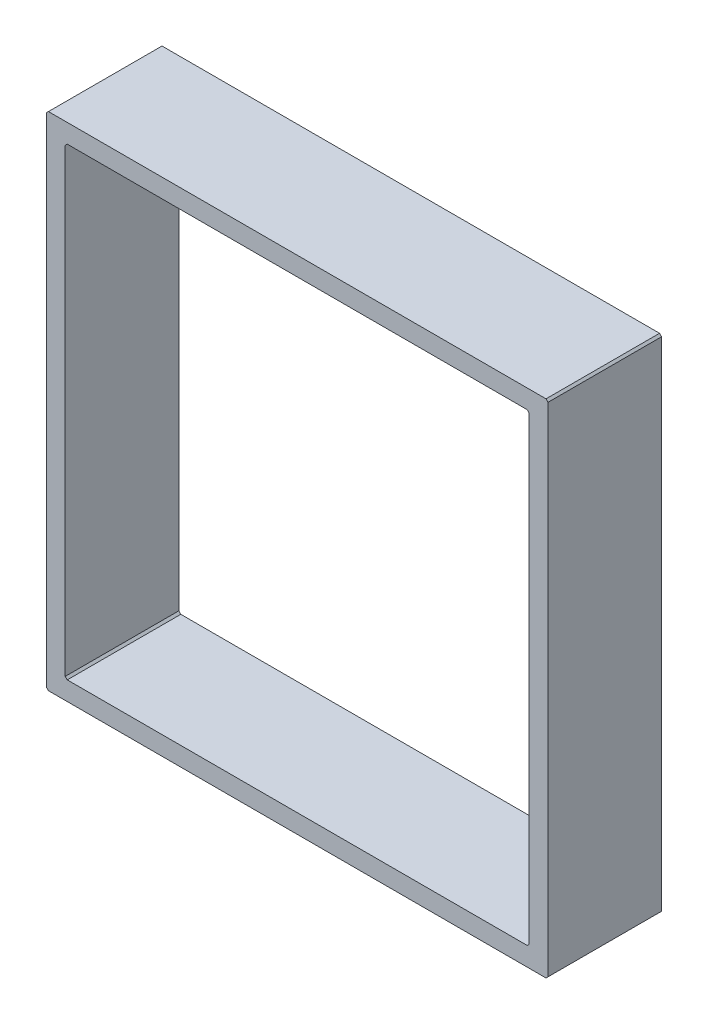
ISO-10303-21;
HEADER;
FILE_DESCRIPTION(('STEP AP214'),'2;1');
FILE_NAME('part.step','',(''),(''),'','','');
FILE_SCHEMA(('AUTOMOTIVE_DESIGN { 1 0 10303 214 1 1 1 1 }'));
ENDSEC;
DATA;
#1=APPLICATION_CONTEXT('core data for automotive mechanical design processes');
#2=APPLICATION_PROTOCOL_DEFINITION('international standard','automotive_design',2000,#1);
#3=PRODUCT_CONTEXT('',#1,'mechanical');
#4=PRODUCT('Part','Part','',(#3));
#5=PRODUCT_RELATED_PRODUCT_CATEGORY('part','',(#4));
#6=PRODUCT_DEFINITION_FORMATION('','',#4);
#7=PRODUCT_DEFINITION_CONTEXT('part definition',#1,'design');
#8=PRODUCT_DEFINITION('design','',#6,#7);
#9=PRODUCT_DEFINITION_SHAPE('','',#8);
#10=(LENGTH_UNIT() NAMED_UNIT(*) SI_UNIT(.MILLI.,.METRE.));
#11=(NAMED_UNIT(*) PLANE_ANGLE_UNIT() SI_UNIT($,.RADIAN.));
#12=(NAMED_UNIT(*) SI_UNIT($,.STERADIAN.) SOLID_ANGLE_UNIT());
#13=UNCERTAINTY_MEASURE_WITH_UNIT(LENGTH_MEASURE(1.E-05),#10,'distance_accuracy_value','');
#14=(GEOMETRIC_REPRESENTATION_CONTEXT(3) GLOBAL_UNCERTAINTY_ASSIGNED_CONTEXT((#13)) GLOBAL_UNIT_ASSIGNED_CONTEXT((#10,
#11,#12)) REPRESENTATION_CONTEXT('',''));
#15=CARTESIAN_POINT('',(0.,0.,0.));
#16=DIRECTION('',(0.,0.,1.));
#17=DIRECTION('',(1.,0.,0.));
#18=AXIS2_PLACEMENT_3D('',#15,#16,#17);
#19=CARTESIAN_POINT('',(-63.5,61.11875,14.375));
#20=DIRECTION('',(1.,0.,0.));
#21=DIRECTION('',(0.,1.,0.));
#22=AXIS2_PLACEMENT_3D('',#19,#20,#21);
#23=PLANE('',#22);
#24=DIRECTION('',(0.,-1.,0.));
#25=VECTOR('',#24,1.);
#26=CARTESIAN_POINT('',(-63.5,61.11875,14.375));
#27=LINE('',#26,#25);
#28=CARTESIAN_POINT('',(-63.5,62.992,14.375));
#29=VERTEX_POINT('',#28);
#30=CARTESIAN_POINT('',(-63.5,-62.992,14.375));
#31=VERTEX_POINT('',#30);
#32=EDGE_CURVE('E246',#29,#31,#27,.T.);
#33=ORIENTED_EDGE('',*,*,#32,.F.);
#34=DIRECTION('',(0.,0.,-1.));
#35=VECTOR('',#34,1.);
#36=CARTESIAN_POINT('',(-63.5,62.992,14.375));
#37=LINE('',#36,#35);
#38=CARTESIAN_POINT('',(-63.5,62.992,-14.375));
#39=VERTEX_POINT('',#38);
#40=EDGE_CURVE('E268',#29,#39,#37,.T.);
#41=ORIENTED_EDGE('',*,*,#40,.T.);
#42=DIRECTION('',(0.,-1.,0.));
#43=VECTOR('',#42,1.);
#44=CARTESIAN_POINT('',(-63.5,61.11875,-14.375));
#45=LINE('',#44,#43);
#46=CARTESIAN_POINT('',(-63.5,-62.992,-14.375));
#47=VERTEX_POINT('',#46);
#48=EDGE_CURVE('E245',#39,#47,#45,.T.);
#49=ORIENTED_EDGE('',*,*,#48,.T.);
#50=DIRECTION('',(0.,0.,-1.));
#51=VECTOR('',#50,1.);
#52=CARTESIAN_POINT('',(-63.5,-62.992,14.375));
#53=LINE('',#52,#51);
#54=EDGE_CURVE('E201',#31,#47,#53,.T.);
#55=ORIENTED_EDGE('',*,*,#54,.F.);
#56=EDGE_LOOP('',(#33,#41,#49,#55));
#57=FACE_BOUND('',#56,.T.);
#58=ADVANCED_FACE('F36',(#57),#23,.F.);
#59=CARTESIAN_POINT('',(-58.7375,61.11875,14.375));
#60=DIRECTION('',(1.,0.,0.));
#61=DIRECTION('',(0.,1.,0.));
#62=AXIS2_PLACEMENT_3D('',#59,#60,#61);
#63=PLANE('',#62);
#64=DIRECTION('',(0.,-1.,0.));
#65=VECTOR('',#64,1.);
#66=CARTESIAN_POINT('',(-58.7375,61.11875,-14.375));
#67=LINE('',#66,#65);
#68=CARTESIAN_POINT('',(-58.7375,58.2295,-14.375));
#69=VERTEX_POINT('',#68);
#70=CARTESIAN_POINT('',(-58.7375,-58.2295,-14.375));
#71=VERTEX_POINT('',#70);
#72=EDGE_CURVE('E258',#69,#71,#67,.T.);
#73=ORIENTED_EDGE('',*,*,#72,.F.);
#74=DIRECTION('',(0.,0.,1.));
#75=VECTOR('',#74,1.);
#76=CARTESIAN_POINT('',(-58.7375,58.2295,14.375));
#77=LINE('',#76,#75);
#78=CARTESIAN_POINT('',(-58.7375,58.2295,14.375));
#79=VERTEX_POINT('',#78);
#80=EDGE_CURVE('E266',#69,#79,#77,.T.);
#81=ORIENTED_EDGE('',*,*,#80,.T.);
#82=DIRECTION('',(0.,-1.,0.));
#83=VECTOR('',#82,1.);
#84=CARTESIAN_POINT('',(-58.7375,61.11875,14.375));
#85=LINE('',#84,#83);
#86=CARTESIAN_POINT('',(-58.7375,-58.2295,14.375));
#87=VERTEX_POINT('',#86);
#88=EDGE_CURVE('E248',#79,#87,#85,.T.);
#89=ORIENTED_EDGE('',*,*,#88,.T.);
#90=DIRECTION('',(0.,0.,1.));
#91=VECTOR('',#90,1.);
#92=CARTESIAN_POINT('',(-58.7375,-58.2295,14.375));
#93=LINE('',#92,#91);
#94=EDGE_CURVE('E198',#71,#87,#93,.T.);
#95=ORIENTED_EDGE('',*,*,#94,.F.);
#96=EDGE_LOOP('',(#73,#81,#89,#95));
#97=FACE_BOUND('',#96,.T.);
#98=ADVANCED_FACE('F281',(#97),#63,.T.);
#99=CARTESIAN_POINT('',(0.,58.7375,14.375));
#100=DIRECTION('',(0.,-1.,0.));
#101=DIRECTION('',(1.,0.,0.));
#102=AXIS2_PLACEMENT_3D('',#99,#100,#101);
#103=PLANE('',#102);
#104=DIRECTION('',(-1.,0.,0.));
#105=VECTOR('',#104,1.);
#106=CARTESIAN_POINT('',(0.,58.7375,14.375));
#107=LINE('',#106,#105);
#108=CARTESIAN_POINT('',(58.2295,58.7375,14.375));
#109=VERTEX_POINT('',#108);
#110=CARTESIAN_POINT('',(-58.2295,58.7375,14.375));
#111=VERTEX_POINT('',#110);
#112=EDGE_CURVE('E251',#109,#111,#107,.T.);
#113=ORIENTED_EDGE('',*,*,#112,.T.);
#114=DIRECTION('',(0.,0.,-1.));
#115=VECTOR('',#114,1.);
#116=CARTESIAN_POINT('',(-58.2295,58.7375,-14.375));
#117=LINE('',#116,#115);
#118=CARTESIAN_POINT('',(-58.2295,58.7375,-14.375));
#119=VERTEX_POINT('',#118);
#120=EDGE_CURVE('E256',#111,#119,#117,.T.);
#121=ORIENTED_EDGE('',*,*,#120,.T.);
#122=DIRECTION('',(-1.,0.,0.));
#123=VECTOR('',#122,1.);
#124=CARTESIAN_POINT('',(0.,58.7375,-14.375));
#125=LINE('',#124,#123);
#126=CARTESIAN_POINT('',(58.2295,58.7375,-14.375));
#127=VERTEX_POINT('',#126);
#128=EDGE_CURVE('E260',#127,#119,#125,.T.);
#129=ORIENTED_EDGE('',*,*,#128,.F.);
#130=DIRECTION('',(0.,0.,-1.));
#131=VECTOR('',#130,1.);
#132=CARTESIAN_POINT('',(58.2295,58.7375,-14.375));
#133=LINE('',#132,#131);
#134=EDGE_CURVE('E221',#109,#127,#133,.T.);
#135=ORIENTED_EDGE('',*,*,#134,.F.);
#136=EDGE_LOOP('',(#113,#121,#129,#135));
#137=FACE_BOUND('',#136,.T.);
#138=ADVANCED_FACE('F290',(#137),#103,.T.);
#139=CARTESIAN_POINT('',(0.,63.5,14.375));
#140=DIRECTION('',(0.,-1.,0.));
#141=DIRECTION('',(1.,0.,0.));
#142=AXIS2_PLACEMENT_3D('',#139,#140,#141);
#143=PLANE('',#142);
#144=DIRECTION('',(-1.,0.,0.));
#145=VECTOR('',#144,1.);
#146=CARTESIAN_POINT('',(0.,63.5,-14.375));
#147=LINE('',#146,#145);
#148=CARTESIAN_POINT('',(62.992,63.5,-14.375));
#149=VERTEX_POINT('',#148);
#150=CARTESIAN_POINT('',(-62.992,63.5,-14.375));
#151=VERTEX_POINT('',#150);
#152=EDGE_CURVE('E249',#149,#151,#147,.T.);
#153=ORIENTED_EDGE('',*,*,#152,.T.);
#154=DIRECTION('',(0.,0.,1.));
#155=VECTOR('',#154,1.);
#156=CARTESIAN_POINT('',(-62.992,63.5,14.375));
#157=LINE('',#156,#155);
#158=CARTESIAN_POINT('',(-62.992,63.5,14.375));
#159=VERTEX_POINT('',#158);
#160=EDGE_CURVE('E51',#151,#159,#157,.T.);
#161=ORIENTED_EDGE('',*,*,#160,.T.);
#162=DIRECTION('',(-1.,0.,0.));
#163=VECTOR('',#162,1.);
#164=CARTESIAN_POINT('',(0.,63.5,14.375));
#165=LINE('',#164,#163);
#166=CARTESIAN_POINT('',(62.992,63.5,14.375));
#167=VERTEX_POINT('',#166);
#168=EDGE_CURVE('E254',#167,#159,#165,.T.);
#169=ORIENTED_EDGE('',*,*,#168,.F.);
#170=DIRECTION('',(0.,0.,1.));
#171=VECTOR('',#170,1.);
#172=CARTESIAN_POINT('',(62.992,63.5,14.375));
#173=LINE('',#172,#171);
#174=EDGE_CURVE('E235',#149,#167,#173,.T.);
#175=ORIENTED_EDGE('',*,*,#174,.F.);
#176=EDGE_LOOP('',(#153,#161,#169,#175));
#177=FACE_BOUND('',#176,.T.);
#178=ADVANCED_FACE('F328',(#177),#143,.F.);
#179=CARTESIAN_POINT('',(-63.5,0.,14.375));
#180=DIRECTION('',(0.,0.,-1.));
#181=DIRECTION('',(-1.,0.,0.));
#182=AXIS2_PLACEMENT_3D('',#179,#180,#181);
#183=PLANE('',#182);
#184=ORIENTED_EDGE('',*,*,#32,.T.);
#185=DIRECTION('',(0.707106781186548,-0.707106781186548,0.));
#186=VECTOR('',#185,1.);
#187=CARTESIAN_POINT('',(-63.5,-62.992,14.375));
#188=LINE('',#187,#186);
#189=CARTESIAN_POINT('',(-62.992,-63.5,14.375));
#190=VERTEX_POINT('',#189);
#191=EDGE_CURVE('E209',#190,#31,#188,.F.);
#192=ORIENTED_EDGE('',*,*,#191,.F.);
#193=DIRECTION('',(-1.,0.,0.));
#194=VECTOR('',#193,1.);
#195=CARTESIAN_POINT('',(0.,-63.5,14.375));
#196=LINE('',#195,#194);
#197=CARTESIAN_POINT('',(62.992,-63.5,14.375));
#198=VERTEX_POINT('',#197);
#199=EDGE_CURVE('E191',#198,#190,#196,.T.);
#200=ORIENTED_EDGE('',*,*,#199,.F.);
#201=DIRECTION('',(-0.707106781186548,-0.707106781186547,0.));
#202=VECTOR('',#201,1.);
#203=CARTESIAN_POINT('',(63.5,-62.992,14.375));
#204=LINE('',#203,#202);
#205=CARTESIAN_POINT('',(63.5,-62.992,14.375));
#206=VERTEX_POINT('',#205);
#207=EDGE_CURVE('E161',#198,#206,#204,.F.);
#208=ORIENTED_EDGE('',*,*,#207,.T.);
#209=DIRECTION('',(0.,-1.,0.));
#210=VECTOR('',#209,1.);
#211=CARTESIAN_POINT('',(63.5,61.11875,14.375));
#212=LINE('',#211,#210);
#213=CARTESIAN_POINT('',(63.5,62.992,14.375));
#214=VERTEX_POINT('',#213);
#215=EDGE_CURVE('E216',#214,#206,#212,.T.);
#216=ORIENTED_EDGE('',*,*,#215,.F.);
#217=DIRECTION('',(-0.707106781186548,0.707106781186547,0.));
#218=VECTOR('',#217,1.);
#219=CARTESIAN_POINT('',(63.5,62.992,14.375));
#220=LINE('',#219,#218);
#221=EDGE_CURVE('E238',#167,#214,#220,.F.);
#222=ORIENTED_EDGE('',*,*,#221,.F.);
#223=ORIENTED_EDGE('',*,*,#168,.T.);
#224=DIRECTION('',(0.707106781186548,0.707106781186548,0.));
#225=VECTOR('',#224,1.);
#226=CARTESIAN_POINT('',(-63.5,62.992,14.375));
#227=LINE('',#226,#225);
#228=EDGE_CURVE('E273',#159,#29,#227,.F.);
#229=ORIENTED_EDGE('',*,*,#228,.T.);
#230=EDGE_LOOP('',(#184,#192,#200,#208,#216,#222,#223,#229));
#231=FACE_BOUND('',#230,.T.);
#232=DIRECTION('',(-0.707106781186538,0.707106781186557,0.));
#233=VECTOR('',#232,1.);
#234=CARTESIAN_POINT('',(-90.2334999999999,-26.7334999999992,14.375));
#235=LINE('',#234,#233);
#236=CARTESIAN_POINT('',(-58.2295,-58.7375,14.375));
#237=VERTEX_POINT('',#236);
#238=EDGE_CURVE('E213',#87,#237,#235,.F.);
#239=ORIENTED_EDGE('',*,*,#238,.F.);
#240=ORIENTED_EDGE('',*,*,#88,.F.);
#241=DIRECTION('',(-0.707106781186538,-0.707106781186557,0.));
#242=VECTOR('',#241,1.);
#243=CARTESIAN_POINT('',(-90.2334999999999,26.7334999999992,14.375));
#244=LINE('',#243,#242);
#245=EDGE_CURVE('E11',#79,#111,#244,.F.);
#246=ORIENTED_EDGE('',*,*,#245,.T.);
#247=ORIENTED_EDGE('',*,*,#112,.F.);
#248=DIRECTION('',(0.707106781186538,-0.707106781186557,0.));
#249=VECTOR('',#248,1.);
#250=CARTESIAN_POINT('',(90.2334999999999,26.7334999999992,14.375));
#251=LINE('',#250,#249);
#252=CARTESIAN_POINT('',(58.7375,58.2295,14.375));
#253=VERTEX_POINT('',#252);
#254=EDGE_CURVE('E242',#253,#109,#251,.F.);
#255=ORIENTED_EDGE('',*,*,#254,.F.);
#256=DIRECTION('',(0.,-1.,0.));
#257=VECTOR('',#256,1.);
#258=CARTESIAN_POINT('',(58.7375,61.11875,14.375));
#259=LINE('',#258,#257);
#260=CARTESIAN_POINT('',(58.7375,-58.2295,14.375));
#261=VERTEX_POINT('',#260);
#262=EDGE_CURVE('E218',#253,#261,#259,.T.);
#263=ORIENTED_EDGE('',*,*,#262,.T.);
#264=DIRECTION('',(0.707106781186538,0.707106781186557,0.));
#265=VECTOR('',#264,1.);
#266=CARTESIAN_POINT('',(90.2334999999999,-26.7334999999992,14.375));
#267=LINE('',#266,#265);
#268=CARTESIAN_POINT('',(58.2295,-58.7375,14.375));
#269=VERTEX_POINT('',#268);
#270=EDGE_CURVE('E160',#261,#269,#267,.F.);
#271=ORIENTED_EDGE('',*,*,#270,.T.);
#272=DIRECTION('',(-1.,0.,0.));
#273=VECTOR('',#272,1.);
#274=CARTESIAN_POINT('',(0.,-58.7375,14.375));
#275=LINE('',#274,#273);
#276=EDGE_CURVE('E175',#269,#237,#275,.T.);
#277=ORIENTED_EDGE('',*,*,#276,.T.);
#278=EDGE_LOOP('',(#239,#240,#246,#247,#255,#263,#271,#277));
#279=FACE_BOUND('',#278,.T.);
#280=ADVANCED_FACE('F287',(#231,#279),#183,.F.);
#281=CARTESIAN_POINT('',(-63.5,0.,-14.375));
#282=DIRECTION('',(0.,0.,-1.));
#283=DIRECTION('',(-1.,0.,0.));
#284=AXIS2_PLACEMENT_3D('',#281,#282,#283);
#285=PLANE('',#284);
#286=DIRECTION('',(-0.707106781186548,0.707106781186548,0.));
#287=VECTOR('',#286,1.);
#288=CARTESIAN_POINT('',(-94.996,-31.496,-14.375));
#289=LINE('',#288,#287);
#290=CARTESIAN_POINT('',(-62.992,-63.5,-14.375));
#291=VERTEX_POINT('',#290);
#292=EDGE_CURVE('E204',#47,#291,#289,.F.);
#293=ORIENTED_EDGE('',*,*,#292,.F.);
#294=ORIENTED_EDGE('',*,*,#48,.F.);
#295=DIRECTION('',(-0.707106781186548,-0.707106781186548,0.));
#296=VECTOR('',#295,1.);
#297=CARTESIAN_POINT('',(-94.996,31.496,-14.375));
#298=LINE('',#297,#296);
#299=EDGE_CURVE('E59',#39,#151,#298,.F.);
#300=ORIENTED_EDGE('',*,*,#299,.T.);
#301=ORIENTED_EDGE('',*,*,#152,.F.);
#302=DIRECTION('',(0.707106781186548,-0.707106781186547,0.));
#303=VECTOR('',#302,1.);
#304=CARTESIAN_POINT('',(94.996,31.496,-14.375));
#305=LINE('',#304,#303);
#306=CARTESIAN_POINT('',(63.5,62.992,-14.375));
#307=VERTEX_POINT('',#306);
#308=EDGE_CURVE('E232',#307,#149,#305,.F.);
#309=ORIENTED_EDGE('',*,*,#308,.F.);
#310=DIRECTION('',(0.,-1.,0.));
#311=VECTOR('',#310,1.);
#312=CARTESIAN_POINT('',(63.5,61.11875,-14.375));
#313=LINE('',#312,#311);
#314=CARTESIAN_POINT('',(63.5,-62.992,-14.375));
#315=VERTEX_POINT('',#314);
#316=EDGE_CURVE('E215',#307,#315,#313,.T.);
#317=ORIENTED_EDGE('',*,*,#316,.T.);
#318=DIRECTION('',(0.707106781186548,0.707106781186547,0.));
#319=VECTOR('',#318,1.);
#320=CARTESIAN_POINT('',(94.996,-31.496,-14.375));
#321=LINE('',#320,#319);
#322=CARTESIAN_POINT('',(62.992,-63.5,-14.375));
#323=VERTEX_POINT('',#322);
#324=EDGE_CURVE('E182',#315,#323,#321,.F.);
#325=ORIENTED_EDGE('',*,*,#324,.T.);
#326=DIRECTION('',(-1.,0.,0.));
#327=VECTOR('',#326,1.);
#328=CARTESIAN_POINT('',(0.,-63.5,-14.375));
#329=LINE('',#328,#327);
#330=EDGE_CURVE('E171',#323,#291,#329,.T.);
#331=ORIENTED_EDGE('',*,*,#330,.T.);
#332=EDGE_LOOP('',(#293,#294,#300,#301,#309,#317,#325,#331));
#333=FACE_BOUND('',#332,.T.);
#334=ORIENTED_EDGE('',*,*,#72,.T.);
#335=DIRECTION('',(0.707106781186538,-0.707106781186557,0.));
#336=VECTOR('',#335,1.);
#337=CARTESIAN_POINT('',(-58.2295,-58.7375,-14.375));
#338=LINE('',#337,#336);
#339=CARTESIAN_POINT('',(-58.2295,-58.7375,-14.375));
#340=VERTEX_POINT('',#339);
#341=EDGE_CURVE('E167',#340,#71,#338,.F.);
#342=ORIENTED_EDGE('',*,*,#341,.F.);
#343=DIRECTION('',(-1.,0.,0.));
#344=VECTOR('',#343,1.);
#345=CARTESIAN_POINT('',(0.,-58.7375,-14.375));
#346=LINE('',#345,#344);
#347=CARTESIAN_POINT('',(58.2295,-58.7375,-14.375));
#348=VERTEX_POINT('',#347);
#349=EDGE_CURVE('E164',#348,#340,#346,.T.);
#350=ORIENTED_EDGE('',*,*,#349,.F.);
#351=DIRECTION('',(-0.707106781186538,-0.707106781186557,0.));
#352=VECTOR('',#351,1.);
#353=CARTESIAN_POINT('',(58.2295,-58.7375,-14.375));
#354=LINE('',#353,#352);
#355=CARTESIAN_POINT('',(58.7375,-58.2295,-14.375));
#356=VERTEX_POINT('',#355);
#357=EDGE_CURVE('E149',#348,#356,#354,.F.);
#358=ORIENTED_EDGE('',*,*,#357,.T.);
#359=DIRECTION('',(0.,-1.,0.));
#360=VECTOR('',#359,1.);
#361=CARTESIAN_POINT('',(58.7375,61.11875,-14.375));
#362=LINE('',#361,#360);
#363=CARTESIAN_POINT('',(58.7375,58.2295,-14.375));
#364=VERTEX_POINT('',#363);
#365=EDGE_CURVE('E219',#364,#356,#362,.T.);
#366=ORIENTED_EDGE('',*,*,#365,.F.);
#367=DIRECTION('',(-0.707106781186538,0.707106781186557,0.));
#368=VECTOR('',#367,1.);
#369=CARTESIAN_POINT('',(58.2295,58.7375,-14.375));
#370=LINE('',#369,#368);
#371=EDGE_CURVE('E240',#127,#364,#370,.F.);
#372=ORIENTED_EDGE('',*,*,#371,.F.);
#373=ORIENTED_EDGE('',*,*,#128,.T.);
#374=DIRECTION('',(0.707106781186538,0.707106781186557,0.));
#375=VECTOR('',#374,1.);
#376=CARTESIAN_POINT('',(-58.2295,58.7375,-14.375));
#377=LINE('',#376,#375);
#378=EDGE_CURVE('E44',#119,#69,#377,.F.);
#379=ORIENTED_EDGE('',*,*,#378,.T.);
#380=EDGE_LOOP('',(#334,#342,#350,#358,#366,#372,#373,#379));
#381=FACE_BOUND('',#380,.T.);
#382=ADVANCED_FACE('F165',(#333,#381),#285,.T.);
#383=CARTESIAN_POINT('',(-58.2295,58.7375,14.375));
#384=DIRECTION('',(0.707106781186557,-0.707106781186538,0.));
#385=DIRECTION('',(0.707106781186538,0.707106781186557,0.));
#386=AXIS2_PLACEMENT_3D('',#383,#384,#385);
#387=PLANE('',#386);
#388=ORIENTED_EDGE('',*,*,#245,.F.);
#389=ORIENTED_EDGE('',*,*,#80,.F.);
#390=ORIENTED_EDGE('',*,*,#378,.F.);
#391=ORIENTED_EDGE('',*,*,#120,.F.);
#392=EDGE_LOOP('',(#388,#389,#390,#391));
#393=FACE_BOUND('',#392,.T.);
#394=ADVANCED_FACE('F284',(#393),#387,.T.);
#395=CARTESIAN_POINT('',(-63.5,62.992,14.375));
#396=DIRECTION('',(0.707106781186547,-0.707106781186547,0.));
#397=DIRECTION('',(0.707106781186548,0.707106781186548,0.));
#398=AXIS2_PLACEMENT_3D('',#395,#396,#397);
#399=PLANE('',#398);
#400=ORIENTED_EDGE('',*,*,#228,.F.);
#401=ORIENTED_EDGE('',*,*,#160,.F.);
#402=ORIENTED_EDGE('',*,*,#299,.F.);
#403=ORIENTED_EDGE('',*,*,#40,.F.);
#404=EDGE_LOOP('',(#400,#401,#402,#403));
#405=FACE_BOUND('',#404,.T.);
#406=ADVANCED_FACE('F38',(#405),#399,.F.);
#407=CARTESIAN_POINT('',(63.5,61.11875,14.375));
#408=DIRECTION('',(-1.,0.,0.));
#409=DIRECTION('',(0.,1.,0.));
#410=AXIS2_PLACEMENT_3D('',#407,#408,#409);
#411=PLANE('',#410);
#412=ORIENTED_EDGE('',*,*,#215,.T.);
#413=DIRECTION('',(0.,0.,-1.));
#414=VECTOR('',#413,1.);
#415=CARTESIAN_POINT('',(63.5,-62.992,14.375));
#416=LINE('',#415,#414);
#417=EDGE_CURVE('E177',#206,#315,#416,.T.);
#418=ORIENTED_EDGE('',*,*,#417,.T.);
#419=ORIENTED_EDGE('',*,*,#316,.F.);
#420=DIRECTION('',(0.,0.,-1.));
#421=VECTOR('',#420,1.);
#422=CARTESIAN_POINT('',(63.5,62.992,14.375));
#423=LINE('',#422,#421);
#424=EDGE_CURVE('E229',#214,#307,#423,.T.);
#425=ORIENTED_EDGE('',*,*,#424,.F.);
#426=EDGE_LOOP('',(#412,#418,#419,#425));
#427=FACE_BOUND('',#426,.T.);
#428=ADVANCED_FACE('F298',(#427),#411,.F.);
#429=CARTESIAN_POINT('',(58.7375,61.11875,14.375));
#430=DIRECTION('',(-1.,0.,0.));
#431=DIRECTION('',(0.,1.,0.));
#432=AXIS2_PLACEMENT_3D('',#429,#430,#431);
#433=PLANE('',#432);
#434=ORIENTED_EDGE('',*,*,#365,.T.);
#435=DIRECTION('',(0.,0.,1.));
#436=VECTOR('',#435,1.);
#437=CARTESIAN_POINT('',(58.7375,-58.2295,14.375));
#438=LINE('',#437,#436);
#439=EDGE_CURVE('E157',#356,#261,#438,.T.);
#440=ORIENTED_EDGE('',*,*,#439,.T.);
#441=ORIENTED_EDGE('',*,*,#262,.F.);
#442=DIRECTION('',(0.,0.,1.));
#443=VECTOR('',#442,1.);
#444=CARTESIAN_POINT('',(58.7375,58.2295,14.375));
#445=LINE('',#444,#443);
#446=EDGE_CURVE('E226',#364,#253,#445,.T.);
#447=ORIENTED_EDGE('',*,*,#446,.F.);
#448=EDGE_LOOP('',(#434,#440,#441,#447));
#449=FACE_BOUND('',#448,.T.);
#450=ADVANCED_FACE('F296',(#449),#433,.T.);
#451=CARTESIAN_POINT('',(58.2295,58.7375,14.375));
#452=DIRECTION('',(-0.707106781186557,-0.707106781186538,0.));
#453=DIRECTION('',(-0.707106781186538,0.707106781186557,0.));
#454=AXIS2_PLACEMENT_3D('',#451,#452,#453);
#455=PLANE('',#454);
#456=ORIENTED_EDGE('',*,*,#254,.T.);
#457=ORIENTED_EDGE('',*,*,#134,.T.);
#458=ORIENTED_EDGE('',*,*,#371,.T.);
#459=ORIENTED_EDGE('',*,*,#446,.T.);
#460=EDGE_LOOP('',(#456,#457,#458,#459));
#461=FACE_BOUND('',#460,.T.);
#462=ADVANCED_FACE('F292',(#461),#455,.T.);
#463=CARTESIAN_POINT('',(63.5,62.992,14.375));
#464=DIRECTION('',(-0.707106781186547,-0.707106781186548,0.));
#465=DIRECTION('',(-0.707106781186548,0.707106781186547,0.));
#466=AXIS2_PLACEMENT_3D('',#463,#464,#465);
#467=PLANE('',#466);
#468=ORIENTED_EDGE('',*,*,#221,.T.);
#469=ORIENTED_EDGE('',*,*,#424,.T.);
#470=ORIENTED_EDGE('',*,*,#308,.T.);
#471=ORIENTED_EDGE('',*,*,#174,.T.);
#472=EDGE_LOOP('',(#468,#469,#470,#471));
#473=FACE_BOUND('',#472,.T.);
#474=ADVANCED_FACE('F304',(#473),#467,.F.);
#475=CARTESIAN_POINT('',(0.,-58.7375,14.375));
#476=DIRECTION('',(0.,1.,0.));
#477=DIRECTION('',(1.,0.,0.));
#478=AXIS2_PLACEMENT_3D('',#475,#476,#477);
#479=PLANE('',#478);
#480=ORIENTED_EDGE('',*,*,#276,.F.);
#481=DIRECTION('',(0.,0.,-1.));
#482=VECTOR('',#481,1.);
#483=CARTESIAN_POINT('',(58.2295,-58.7375,-14.375));
#484=LINE('',#483,#482);
#485=EDGE_CURVE('E154',#269,#348,#484,.T.);
#486=ORIENTED_EDGE('',*,*,#485,.T.);
#487=ORIENTED_EDGE('',*,*,#349,.T.);
#488=DIRECTION('',(0.,0.,-1.));
#489=VECTOR('',#488,1.);
#490=CARTESIAN_POINT('',(-58.2295,-58.7375,-14.375));
#491=LINE('',#490,#489);
#492=EDGE_CURVE('E193',#237,#340,#491,.T.);
#493=ORIENTED_EDGE('',*,*,#492,.F.);
#494=EDGE_LOOP('',(#480,#486,#487,#493));
#495=FACE_BOUND('',#494,.T.);
#496=ADVANCED_FACE('F173',(#495),#479,.T.);
#497=CARTESIAN_POINT('',(0.,-63.5,14.375));
#498=DIRECTION('',(0.,1.,0.));
#499=DIRECTION('',(1.,0.,0.));
#500=AXIS2_PLACEMENT_3D('',#497,#498,#499);
#501=PLANE('',#500);
#502=ORIENTED_EDGE('',*,*,#330,.F.);
#503=DIRECTION('',(0.,0.,1.));
#504=VECTOR('',#503,1.);
#505=CARTESIAN_POINT('',(62.992,-63.5,14.375));
#506=LINE('',#505,#504);
#507=EDGE_CURVE('E184',#323,#198,#506,.T.);
#508=ORIENTED_EDGE('',*,*,#507,.T.);
#509=ORIENTED_EDGE('',*,*,#199,.T.);
#510=DIRECTION('',(0.,0.,1.));
#511=VECTOR('',#510,1.);
#512=CARTESIAN_POINT('',(-62.992,-63.5,14.375));
#513=LINE('',#512,#511);
#514=EDGE_CURVE('E206',#291,#190,#513,.T.);
#515=ORIENTED_EDGE('',*,*,#514,.F.);
#516=EDGE_LOOP('',(#502,#508,#509,#515));
#517=FACE_BOUND('',#516,.T.);
#518=ADVANCED_FACE('F381',(#517),#501,.F.);
#519=CARTESIAN_POINT('',(-58.2295,-58.7375,14.375));
#520=DIRECTION('',(0.707106781186557,0.707106781186538,0.));
#521=DIRECTION('',(0.707106781186538,-0.707106781186557,0.));
#522=AXIS2_PLACEMENT_3D('',#519,#520,#521);
#523=PLANE('',#522);
#524=ORIENTED_EDGE('',*,*,#238,.T.);
#525=ORIENTED_EDGE('',*,*,#492,.T.);
#526=ORIENTED_EDGE('',*,*,#341,.T.);
#527=ORIENTED_EDGE('',*,*,#94,.T.);
#528=EDGE_LOOP('',(#524,#525,#526,#527));
#529=FACE_BOUND('',#528,.T.);
#530=ADVANCED_FACE('F392',(#529),#523,.T.);
#531=CARTESIAN_POINT('',(-63.5,-62.992,14.375));
#532=DIRECTION('',(0.707106781186547,0.707106781186547,0.));
#533=DIRECTION('',(0.707106781186548,-0.707106781186548,0.));
#534=AXIS2_PLACEMENT_3D('',#531,#532,#533);
#535=PLANE('',#534);
#536=ORIENTED_EDGE('',*,*,#191,.T.);
#537=ORIENTED_EDGE('',*,*,#54,.T.);
#538=ORIENTED_EDGE('',*,*,#292,.T.);
#539=ORIENTED_EDGE('',*,*,#514,.T.);
#540=EDGE_LOOP('',(#536,#537,#538,#539));
#541=FACE_BOUND('',#540,.T.);
#542=ADVANCED_FACE('F402',(#541),#535,.F.);
#543=CARTESIAN_POINT('',(58.2295,-58.7375,14.375));
#544=DIRECTION('',(-0.707106781186557,0.707106781186538,0.));
#545=DIRECTION('',(-0.707106781186538,-0.707106781186557,0.));
#546=AXIS2_PLACEMENT_3D('',#543,#544,#545);
#547=PLANE('',#546);
#548=ORIENTED_EDGE('',*,*,#270,.F.);
#549=ORIENTED_EDGE('',*,*,#439,.F.);
#550=ORIENTED_EDGE('',*,*,#357,.F.);
#551=ORIENTED_EDGE('',*,*,#485,.F.);
#552=EDGE_LOOP('',(#548,#549,#550,#551));
#553=FACE_BOUND('',#552,.T.);
#554=ADVANCED_FACE('F152',(#553),#547,.T.);
#555=CARTESIAN_POINT('',(63.5,-62.992,14.375));
#556=DIRECTION('',(-0.707106781186547,0.707106781186548,0.));
#557=DIRECTION('',(-0.707106781186548,-0.707106781186547,0.));
#558=AXIS2_PLACEMENT_3D('',#555,#556,#557);
#559=PLANE('',#558);
#560=ORIENTED_EDGE('',*,*,#207,.F.);
#561=ORIENTED_EDGE('',*,*,#507,.F.);
#562=ORIENTED_EDGE('',*,*,#324,.F.);
#563=ORIENTED_EDGE('',*,*,#417,.F.);
#564=EDGE_LOOP('',(#560,#561,#562,#563));
#565=FACE_BOUND('',#564,.T.);
#566=ADVANCED_FACE('F420',(#565),#559,.F.);
#567=CLOSED_SHELL('',(#58,#98,#138,#178,#280,#382,#394,#406,#428,#450,#462,#474,#496,#518,#530,
#542,#554,#566));
#568=MANIFOLD_SOLID_BREP('B2',#567);
#569=ADVANCED_BREP_SHAPE_REPRESENTATION('',(#18,#568),#14);
#570=SHAPE_DEFINITION_REPRESENTATION(#9,#569);
ENDSEC;
END-ISO-10303-21;
